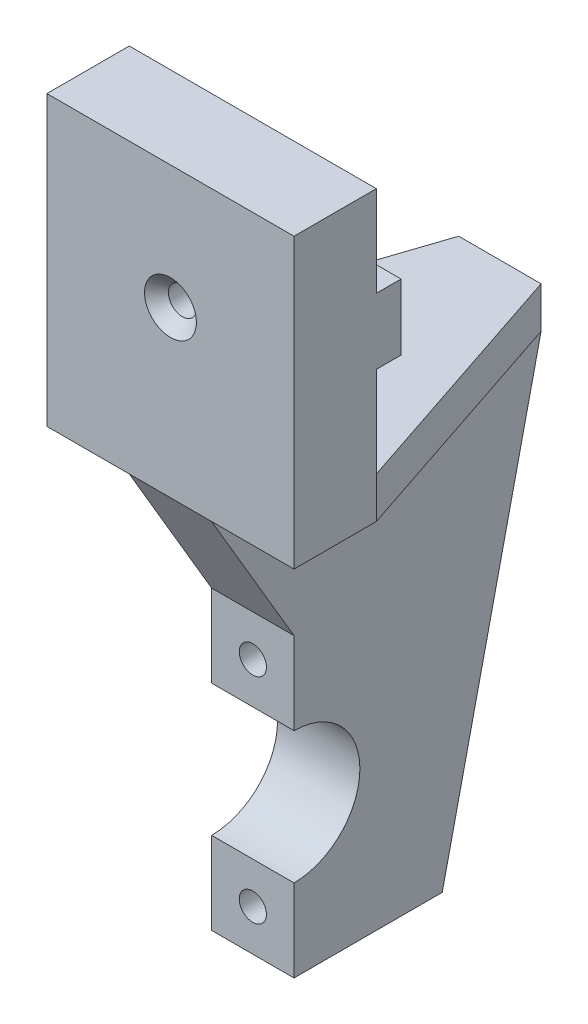
ISO-10303-21;
HEADER;
FILE_DESCRIPTION(('STEP AP214'),'2;1');
FILE_NAME('part.step','',(''),(''),'','','');
FILE_SCHEMA(('AUTOMOTIVE_DESIGN { 1 0 10303 214 1 1 1 1 }'));
ENDSEC;
DATA;
#1=APPLICATION_CONTEXT('core data for automotive mechanical design processes');
#2=APPLICATION_PROTOCOL_DEFINITION('international standard','automotive_design',2000,#1);
#3=PRODUCT_CONTEXT('',#1,'mechanical');
#4=PRODUCT('Part','Part','',(#3));
#5=PRODUCT_RELATED_PRODUCT_CATEGORY('part','',(#4));
#6=PRODUCT_DEFINITION_FORMATION('','',#4);
#7=PRODUCT_DEFINITION_CONTEXT('part definition',#1,'design');
#8=PRODUCT_DEFINITION('design','',#6,#7);
#9=PRODUCT_DEFINITION_SHAPE('','',#8);
#10=(LENGTH_UNIT() NAMED_UNIT(*) SI_UNIT(.MILLI.,.METRE.));
#11=(NAMED_UNIT(*) PLANE_ANGLE_UNIT() SI_UNIT($,.RADIAN.));
#12=(NAMED_UNIT(*) SI_UNIT($,.STERADIAN.) SOLID_ANGLE_UNIT());
#13=UNCERTAINTY_MEASURE_WITH_UNIT(LENGTH_MEASURE(1.E-05),#10,'distance_accuracy_value','');
#14=(GEOMETRIC_REPRESENTATION_CONTEXT(3) GLOBAL_UNCERTAINTY_ASSIGNED_CONTEXT((#13)) GLOBAL_UNIT_ASSIGNED_CONTEXT((#10,
#11,#12)) REPRESENTATION_CONTEXT('',''));
#15=CARTESIAN_POINT('',(0.,0.,0.));
#16=DIRECTION('',(0.,0.,1.));
#17=DIRECTION('',(1.,0.,0.));
#18=AXIS2_PLACEMENT_3D('',#15,#16,#17);
#19=CARTESIAN_POINT('',(0.,0.,0.));
#20=DIRECTION('',(0.,0.,1.));
#21=DIRECTION('',(1.,0.,0.));
#22=AXIS2_PLACEMENT_3D('',#19,#20,#21);
#23=PLANE('',#22);
#24=CARTESIAN_POINT('',(15.,15.,0.));
#25=DIRECTION('',(0.,0.,1.));
#26=DIRECTION('',(1.,0.,0.));
#27=AXIS2_PLACEMENT_3D('',#24,#25,#26);
#28=CIRCLE('',#27,1.7);
#29=CARTESIAN_POINT('',(16.7,15.,0.));
#30=VERTEX_POINT('',#29);
#31=EDGE_CURVE('E203',#30,#30,#28,.T.);
#32=ORIENTED_EDGE('',*,*,#31,.T.);
#33=EDGE_LOOP('',(#32));
#34=FACE_BOUND('',#33,.T.);
#35=DIRECTION('',(1.,0.,0.));
#36=VECTOR('',#35,1.);
#37=CARTESIAN_POINT('',(0.,19.,0.));
#38=LINE('',#37,#36);
#39=CARTESIAN_POINT('',(0.,19.,0.));
#40=VERTEX_POINT('',#39);
#41=CARTESIAN_POINT('',(5.,19.,0.));
#42=VERTEX_POINT('',#41);
#43=EDGE_CURVE('E212',#40,#42,#38,.T.);
#44=ORIENTED_EDGE('',*,*,#43,.F.);
#45=DIRECTION('',(0.,-1.,0.));
#46=VECTOR('',#45,1.);
#47=CARTESIAN_POINT('',(0.,30.,0.));
#48=LINE('',#47,#46);
#49=CARTESIAN_POINT('',(0.,30.,0.));
#50=VERTEX_POINT('',#49);
#51=EDGE_CURVE('E358',#50,#40,#48,.T.);
#52=ORIENTED_EDGE('',*,*,#51,.F.);
#53=DIRECTION('',(-1.,0.,0.));
#54=VECTOR('',#53,1.);
#55=CARTESIAN_POINT('',(0.,30.,0.));
#56=LINE('',#55,#54);
#57=CARTESIAN_POINT('',(30.,30.,0.));
#58=VERTEX_POINT('',#57);
#59=EDGE_CURVE('E354',#58,#50,#56,.T.);
#60=ORIENTED_EDGE('',*,*,#59,.F.);
#61=DIRECTION('',(0.,1.,0.));
#62=VECTOR('',#61,1.);
#63=CARTESIAN_POINT('',(30.,30.,0.));
#64=LINE('',#63,#62);
#65=CARTESIAN_POINT('',(30.,19.,0.));
#66=VERTEX_POINT('',#65);
#67=EDGE_CURVE('E364',#66,#58,#64,.T.);
#68=ORIENTED_EDGE('',*,*,#67,.F.);
#69=DIRECTION('',(1.,0.,0.));
#70=VECTOR('',#69,1.);
#71=CARTESIAN_POINT('',(30.,19.,0.));
#72=LINE('',#71,#70);
#73=CARTESIAN_POINT('',(25.,19.,0.));
#74=VERTEX_POINT('',#73);
#75=EDGE_CURVE('E241',#74,#66,#72,.T.);
#76=ORIENTED_EDGE('',*,*,#75,.F.);
#77=DIRECTION('',(0.,1.,0.));
#78=VECTOR('',#77,1.);
#79=CARTESIAN_POINT('',(25.,19.,0.));
#80=LINE('',#79,#78);
#81=CARTESIAN_POINT('',(25.,11.,0.));
#82=VERTEX_POINT('',#81);
#83=EDGE_CURVE('E58',#82,#74,#80,.T.);
#84=ORIENTED_EDGE('',*,*,#83,.F.);
#85=DIRECTION('',(-1.,0.,0.));
#86=VECTOR('',#85,1.);
#87=CARTESIAN_POINT('',(30.,11.,0.));
#88=LINE('',#87,#86);
#89=CARTESIAN_POINT('',(30.,11.,0.));
#90=VERTEX_POINT('',#89);
#91=EDGE_CURVE('E236',#90,#82,#88,.T.);
#92=ORIENTED_EDGE('',*,*,#91,.F.);
#93=CARTESIAN_POINT('',(30.,0.,0.));
#94=VERTEX_POINT('',#93);
#95=EDGE_CURVE('E365',#94,#90,#64,.T.);
#96=ORIENTED_EDGE('',*,*,#95,.F.);
#97=DIRECTION('',(1.,0.,0.));
#98=VECTOR('',#97,1.);
#99=CARTESIAN_POINT('',(0.,0.,0.));
#100=LINE('',#99,#98);
#101=CARTESIAN_POINT('',(0.,0.,0.));
#102=VERTEX_POINT('',#101);
#103=EDGE_CURVE('E361',#102,#94,#100,.T.);
#104=ORIENTED_EDGE('',*,*,#103,.F.);
#105=CARTESIAN_POINT('',(0.,11.,0.));
#106=VERTEX_POINT('',#105);
#107=EDGE_CURVE('E349',#106,#102,#48,.T.);
#108=ORIENTED_EDGE('',*,*,#107,.F.);
#109=DIRECTION('',(-1.,0.,0.));
#110=VECTOR('',#109,1.);
#111=CARTESIAN_POINT('',(0.,11.,0.));
#112=LINE('',#111,#110);
#113=CARTESIAN_POINT('',(5.,11.,0.));
#114=VERTEX_POINT('',#113);
#115=EDGE_CURVE('E217',#114,#106,#112,.T.);
#116=ORIENTED_EDGE('',*,*,#115,.F.);
#117=DIRECTION('',(0.,-1.,0.));
#118=VECTOR('',#117,1.);
#119=CARTESIAN_POINT('',(5.,19.,0.));
#120=LINE('',#119,#118);
#121=EDGE_CURVE('E224',#42,#114,#120,.T.);
#122=ORIENTED_EDGE('',*,*,#121,.F.);
#123=EDGE_LOOP('',(#44,#52,#60,#68,#76,#84,#92,#96,#104,#108,#116,#122));
#124=FACE_BOUND('',#123,.T.);
#125=ADVANCED_FACE('F35',(#34,#124),#23,.F.);
#126=CARTESIAN_POINT('',(0.,-5.,0.));
#127=DIRECTION('',(0.,-1.,0.));
#128=DIRECTION('',(0.,0.,-1.));
#129=AXIS2_PLACEMENT_3D('',#126,#127,#128);
#130=PLANE('',#129);
#131=DIRECTION('',(0.316227766016838,0.,-0.948683298050514));
#132=VECTOR('',#131,1.);
#133=CARTESIAN_POINT('',(0.,-5.,0.));
#134=LINE('',#133,#132);
#135=CARTESIAN_POINT('',(0.,-5.,0.));
#136=VERTEX_POINT('',#135);
#137=CARTESIAN_POINT('',(10.,-5.,-30.));
#138=VERTEX_POINT('',#137);
#139=EDGE_CURVE('E318',#136,#138,#134,.T.);
#140=ORIENTED_EDGE('',*,*,#139,.T.);
#141=DIRECTION('',(0.,0.,1.));
#142=VECTOR('',#141,1.);
#143=CARTESIAN_POINT('',(10.,-5.,10.));
#144=LINE('',#143,#142);
#145=CARTESIAN_POINT('',(10.,-5.,10.));
#146=VERTEX_POINT('',#145);
#147=EDGE_CURVE('E292',#138,#146,#144,.T.);
#148=ORIENTED_EDGE('',*,*,#147,.T.);
#149=DIRECTION('',(-1.,0.,0.));
#150=VECTOR('',#149,1.);
#151=CARTESIAN_POINT('',(0.,-5.,10.));
#152=LINE('',#151,#150);
#153=CARTESIAN_POINT('',(0.,-5.,10.));
#154=VERTEX_POINT('',#153);
#155=EDGE_CURVE('E329',#146,#154,#152,.T.);
#156=ORIENTED_EDGE('',*,*,#155,.T.);
#157=DIRECTION('',(0.,0.,-1.));
#158=VECTOR('',#157,1.);
#159=CARTESIAN_POINT('',(0.,-5.,10.));
#160=LINE('',#159,#158);
#161=EDGE_CURVE('E315',#154,#136,#160,.T.);
#162=ORIENTED_EDGE('',*,*,#161,.T.);
#163=EDGE_LOOP('',(#140,#148,#156,#162));
#164=FACE_BOUND('',#163,.T.);
#165=ADVANCED_FACE('F401',(#164),#130,.T.);
#166=CARTESIAN_POINT('',(0.,30.,10.));
#167=DIRECTION('',(1.,0.,0.));
#168=DIRECTION('',(0.,0.,-1.));
#169=AXIS2_PLACEMENT_3D('',#166,#167,#168);
#170=PLANE('',#169);
#171=ORIENTED_EDGE('',*,*,#51,.T.);
#172=DIRECTION('',(0.,0.,1.));
#173=VECTOR('',#172,1.);
#174=CARTESIAN_POINT('',(0.,19.,-3.));
#175=LINE('',#174,#173);
#176=CARTESIAN_POINT('',(0.,19.,-3.));
#177=VERTEX_POINT('',#176);
#178=EDGE_CURVE('E234',#177,#40,#175,.T.);
#179=ORIENTED_EDGE('',*,*,#178,.F.);
#180=DIRECTION('',(0.,1.,0.));
#181=VECTOR('',#180,1.);
#182=CARTESIAN_POINT('',(0.,19.,-3.));
#183=LINE('',#182,#181);
#184=CARTESIAN_POINT('',(0.,11.,-3.));
#185=VERTEX_POINT('',#184);
#186=EDGE_CURVE('E213',#185,#177,#183,.T.);
#187=ORIENTED_EDGE('',*,*,#186,.F.);
#188=DIRECTION('',(0.,0.,1.));
#189=VECTOR('',#188,1.);
#190=CARTESIAN_POINT('',(0.,11.,-3.));
#191=LINE('',#190,#189);
#192=EDGE_CURVE('E50',#185,#106,#191,.T.);
#193=ORIENTED_EDGE('',*,*,#192,.T.);
#194=ORIENTED_EDGE('',*,*,#107,.T.);
#195=DIRECTION('',(0.,1.,0.));
#196=VECTOR('',#195,1.);
#197=CARTESIAN_POINT('',(0.,-5.,0.));
#198=LINE('',#197,#196);
#199=EDGE_CURVE('E346',#136,#102,#198,.T.);
#200=ORIENTED_EDGE('',*,*,#199,.F.);
#201=ORIENTED_EDGE('',*,*,#161,.F.);
#202=DIRECTION('',(0.,-1.,0.));
#203=VECTOR('',#202,1.);
#204=CARTESIAN_POINT('',(0.,30.,10.));
#205=LINE('',#204,#203);
#206=CARTESIAN_POINT('',(0.,30.,10.));
#207=VERTEX_POINT('',#206);
#208=EDGE_CURVE('E350',#207,#154,#205,.T.);
#209=ORIENTED_EDGE('',*,*,#208,.F.);
#210=DIRECTION('',(0.,0.,-1.));
#211=VECTOR('',#210,1.);
#212=CARTESIAN_POINT('',(0.,30.,10.));
#213=LINE('',#212,#211);
#214=EDGE_CURVE('E43',#207,#50,#213,.T.);
#215=ORIENTED_EDGE('',*,*,#214,.T.);
#216=EDGE_LOOP('',(#171,#179,#187,#193,#194,#200,#201,#209,#215));
#217=FACE_BOUND('',#216,.T.);
#218=ADVANCED_FACE('F37',(#217),#170,.F.);
#219=CARTESIAN_POINT('',(30.,30.,10.));
#220=DIRECTION('',(-1.,0.,0.));
#221=DIRECTION('',(0.,-1.,0.));
#222=AXIS2_PLACEMENT_3D('',#219,#220,#221);
#223=PLANE('',#222);
#224=ORIENTED_EDGE('',*,*,#95,.T.);
#225=DIRECTION('',(0.,0.,1.));
#226=VECTOR('',#225,1.);
#227=CARTESIAN_POINT('',(30.,11.,-3.));
#228=LINE('',#227,#226);
#229=CARTESIAN_POINT('',(30.,11.,-3.));
#230=VERTEX_POINT('',#229);
#231=EDGE_CURVE('E260',#230,#90,#228,.T.);
#232=ORIENTED_EDGE('',*,*,#231,.F.);
#233=DIRECTION('',(0.,-1.,0.));
#234=VECTOR('',#233,1.);
#235=CARTESIAN_POINT('',(30.,19.,-3.));
#236=LINE('',#235,#234);
#237=CARTESIAN_POINT('',(30.,19.,-3.));
#238=VERTEX_POINT('',#237);
#239=EDGE_CURVE('E237',#238,#230,#236,.T.);
#240=ORIENTED_EDGE('',*,*,#239,.F.);
#241=DIRECTION('',(0.,0.,1.));
#242=VECTOR('',#241,1.);
#243=CARTESIAN_POINT('',(30.,19.,-3.));
#244=LINE('',#243,#242);
#245=EDGE_CURVE('E247',#238,#66,#244,.T.);
#246=ORIENTED_EDGE('',*,*,#245,.T.);
#247=ORIENTED_EDGE('',*,*,#67,.T.);
#248=DIRECTION('',(0.,0.,-1.));
#249=VECTOR('',#248,1.);
#250=CARTESIAN_POINT('',(30.,30.,10.));
#251=LINE('',#250,#249);
#252=CARTESIAN_POINT('',(30.,30.,10.));
#253=VERTEX_POINT('',#252);
#254=EDGE_CURVE('E11',#253,#58,#251,.T.);
#255=ORIENTED_EDGE('',*,*,#254,.F.);
#256=DIRECTION('',(0.,1.,0.));
#257=VECTOR('',#256,1.);
#258=CARTESIAN_POINT('',(30.,30.,10.));
#259=LINE('',#258,#257);
#260=CARTESIAN_POINT('',(30.,-5.,10.));
#261=VERTEX_POINT('',#260);
#262=EDGE_CURVE('E353',#261,#253,#259,.T.);
#263=ORIENTED_EDGE('',*,*,#262,.F.);
#264=DIRECTION('',(0.,0.,1.));
#265=VECTOR('',#264,1.);
#266=CARTESIAN_POINT('',(30.,-5.,10.));
#267=LINE('',#266,#265);
#268=CARTESIAN_POINT('',(30.,-5.,0.));
#269=VERTEX_POINT('',#268);
#270=EDGE_CURVE('E326',#269,#261,#267,.T.);
#271=ORIENTED_EDGE('',*,*,#270,.F.);
#272=DIRECTION('',(0.,1.,0.));
#273=VECTOR('',#272,1.);
#274=CARTESIAN_POINT('',(30.,-5.,0.));
#275=LINE('',#274,#273);
#276=EDGE_CURVE('E332',#269,#94,#275,.T.);
#277=ORIENTED_EDGE('',*,*,#276,.T.);
#278=EDGE_LOOP('',(#224,#232,#240,#246,#247,#255,#263,#271,#277));
#279=FACE_BOUND('',#278,.T.);
#280=ADVANCED_FACE('F411',(#279),#223,.F.);
#281=CARTESIAN_POINT('',(0.,30.,10.));
#282=DIRECTION('',(0.,-1.,0.));
#283=DIRECTION('',(0.,0.,-1.));
#284=AXIS2_PLACEMENT_3D('',#281,#282,#283);
#285=PLANE('',#284);
#286=ORIENTED_EDGE('',*,*,#59,.T.);
#287=ORIENTED_EDGE('',*,*,#214,.F.);
#288=DIRECTION('',(-1.,0.,0.));
#289=VECTOR('',#288,1.);
#290=CARTESIAN_POINT('',(0.,30.,10.));
#291=LINE('',#290,#289);
#292=EDGE_CURVE('E356',#253,#207,#291,.T.);
#293=ORIENTED_EDGE('',*,*,#292,.F.);
#294=ORIENTED_EDGE('',*,*,#254,.T.);
#295=EDGE_LOOP('',(#286,#287,#293,#294));
#296=FACE_BOUND('',#295,.T.);
#297=ADVANCED_FACE('F409',(#296),#285,.F.);
#298=CARTESIAN_POINT('',(0.,0.,10.));
#299=DIRECTION('',(0.,0.,1.));
#300=DIRECTION('',(1.,0.,0.));
#301=AXIS2_PLACEMENT_3D('',#298,#299,#300);
#302=PLANE('',#301);
#303=CARTESIAN_POINT('',(15.,15.,10.));
#304=DIRECTION('',(0.,0.,1.));
#305=DIRECTION('',(1.,0.,0.));
#306=AXIS2_PLACEMENT_3D('',#303,#304,#305);
#307=CIRCLE('',#306,3.15);
#308=CARTESIAN_POINT('',(18.15,15.,10.));
#309=VERTEX_POINT('',#308);
#310=EDGE_CURVE('E209',#309,#309,#307,.T.);
#311=ORIENTED_EDGE('',*,*,#310,.F.);
#312=EDGE_LOOP('',(#311));
#313=FACE_BOUND('',#312,.T.);
#314=ORIENTED_EDGE('',*,*,#208,.T.);
#315=ORIENTED_EDGE('',*,*,#155,.F.);
#316=DIRECTION('',(-1.,0.,0.));
#317=VECTOR('',#316,1.);
#318=CARTESIAN_POINT('',(20.,-5.,10.));
#319=LINE('',#318,#317);
#320=CARTESIAN_POINT('',(20.,-5.,10.));
#321=VERTEX_POINT('',#320);
#322=EDGE_CURVE('E302',#321,#146,#319,.T.);
#323=ORIENTED_EDGE('',*,*,#322,.F.);
#324=EDGE_CURVE('E330',#261,#321,#152,.T.);
#325=ORIENTED_EDGE('',*,*,#324,.F.);
#326=ORIENTED_EDGE('',*,*,#262,.T.);
#327=ORIENTED_EDGE('',*,*,#292,.T.);
#328=EDGE_LOOP('',(#314,#315,#323,#325,#326,#327));
#329=FACE_BOUND('',#328,.T.);
#330=ADVANCED_FACE('F406',(#313,#329),#302,.T.);
#331=CARTESIAN_POINT('',(0.,0.,0.));
#332=DIRECTION('',(0.,-1.,0.));
#333=DIRECTION('',(0.,0.,-1.));
#334=AXIS2_PLACEMENT_3D('',#331,#332,#333);
#335=PLANE('',#334);
#336=DIRECTION('',(0.316227766016838,0.,-0.948683298050514));
#337=VECTOR('',#336,1.);
#338=CARTESIAN_POINT('',(0.,0.,0.));
#339=LINE('',#338,#337);
#340=CARTESIAN_POINT('',(10.,0.,-30.));
#341=VERTEX_POINT('',#340);
#342=EDGE_CURVE('E314',#102,#341,#339,.T.);
#343=ORIENTED_EDGE('',*,*,#342,.F.);
#344=ORIENTED_EDGE('',*,*,#103,.T.);
#345=DIRECTION('',(0.316227766016838,0.,0.948683298050514));
#346=VECTOR('',#345,1.);
#347=CARTESIAN_POINT('',(20.,0.,-30.));
#348=LINE('',#347,#346);
#349=CARTESIAN_POINT('',(20.,0.,-30.));
#350=VERTEX_POINT('',#349);
#351=EDGE_CURVE('E319',#350,#94,#348,.T.);
#352=ORIENTED_EDGE('',*,*,#351,.F.);
#353=DIRECTION('',(1.,0.,0.));
#354=VECTOR('',#353,1.);
#355=CARTESIAN_POINT('',(10.,0.,-30.));
#356=LINE('',#355,#354);
#357=EDGE_CURVE('E334',#341,#350,#356,.T.);
#358=ORIENTED_EDGE('',*,*,#357,.F.);
#359=EDGE_LOOP('',(#343,#344,#352,#358));
#360=FACE_BOUND('',#359,.T.);
#361=ADVANCED_FACE('F434',(#360),#335,.F.);
#362=CARTESIAN_POINT('',(0.,-5.,0.));
#363=DIRECTION('',(0.948683298050514,0.,0.316227766016838));
#364=DIRECTION('',(0.316227766016838,0.,-0.948683298050514));
#365=AXIS2_PLACEMENT_3D('',#362,#363,#364);
#366=PLANE('',#365);
#367=ORIENTED_EDGE('',*,*,#342,.T.);
#368=DIRECTION('',(0.,1.,0.));
#369=VECTOR('',#368,1.);
#370=CARTESIAN_POINT('',(10.,-5.,-30.));
#371=LINE('',#370,#369);
#372=EDGE_CURVE('E343',#138,#341,#371,.T.);
#373=ORIENTED_EDGE('',*,*,#372,.F.);
#374=ORIENTED_EDGE('',*,*,#139,.F.);
#375=ORIENTED_EDGE('',*,*,#199,.T.);
#376=EDGE_LOOP('',(#367,#373,#374,#375));
#377=FACE_BOUND('',#376,.T.);
#378=ADVANCED_FACE('F397',(#377),#366,.F.);
#379=CARTESIAN_POINT('',(10.,-5.,-30.));
#380=DIRECTION('',(0.,0.,1.));
#381=DIRECTION('',(1.,0.,0.));
#382=AXIS2_PLACEMENT_3D('',#379,#380,#381);
#383=PLANE('',#382);
#384=ORIENTED_EDGE('',*,*,#357,.T.);
#385=DIRECTION('',(0.,1.,0.));
#386=VECTOR('',#385,1.);
#387=CARTESIAN_POINT('',(20.,-5.,-30.));
#388=LINE('',#387,#386);
#389=CARTESIAN_POINT('',(20.,-5.,-30.));
#390=VERTEX_POINT('',#389);
#391=EDGE_CURVE('E340',#390,#350,#388,.T.);
#392=ORIENTED_EDGE('',*,*,#391,.F.);
#393=DIRECTION('',(1.,0.,0.));
#394=VECTOR('',#393,1.);
#395=CARTESIAN_POINT('',(10.,-5.,-30.));
#396=LINE('',#395,#394);
#397=EDGE_CURVE('E321',#138,#390,#396,.T.);
#398=ORIENTED_EDGE('',*,*,#397,.F.);
#399=ORIENTED_EDGE('',*,*,#372,.T.);
#400=EDGE_LOOP('',(#384,#392,#398,#399));
#401=FACE_BOUND('',#400,.T.);
#402=ADVANCED_FACE('F436',(#401),#383,.F.);
#403=CARTESIAN_POINT('',(20.,-5.,-30.));
#404=DIRECTION('',(-0.948683298050514,0.,0.316227766016838));
#405=DIRECTION('',(0.316227766016838,0.,0.948683298050514));
#406=AXIS2_PLACEMENT_3D('',#403,#404,#405);
#407=PLANE('',#406);
#408=ORIENTED_EDGE('',*,*,#351,.T.);
#409=ORIENTED_EDGE('',*,*,#276,.F.);
#410=DIRECTION('',(0.316227766016838,0.,0.948683298050514));
#411=VECTOR('',#410,1.);
#412=CARTESIAN_POINT('',(20.,-5.,-30.));
#413=LINE('',#412,#411);
#414=EDGE_CURVE('E324',#390,#269,#413,.T.);
#415=ORIENTED_EDGE('',*,*,#414,.F.);
#416=ORIENTED_EDGE('',*,*,#391,.T.);
#417=EDGE_LOOP('',(#408,#409,#415,#416));
#418=FACE_BOUND('',#417,.T.);
#419=ADVANCED_FACE('F429',(#418),#407,.F.);
#420=DIRECTION('',(0.,0.,1.));
#421=VECTOR('',#420,1.);
#422=CARTESIAN_POINT('',(20.,-5.,10.));
#423=LINE('',#422,#421);
#424=EDGE_CURVE('E275',#390,#321,#423,.T.);
#425=ORIENTED_EDGE('',*,*,#424,.F.);
#426=ORIENTED_EDGE('',*,*,#414,.T.);
#427=ORIENTED_EDGE('',*,*,#270,.T.);
#428=ORIENTED_EDGE('',*,*,#324,.T.);
#429=EDGE_LOOP('',(#425,#426,#427,#428));
#430=FACE_BOUND('',#429,.T.);
#431=ADVANCED_FACE('F461',(#430),#130,.T.);
#432=CARTESIAN_POINT('',(20.,-40.,0.));
#433=DIRECTION('',(-1.,0.,0.));
#434=DIRECTION('',(0.,-1.,0.));
#435=AXIS2_PLACEMENT_3D('',#432,#433,#434);
#436=CYLINDRICAL_SURFACE('',#435,8.);
#437=CARTESIAN_POINT('',(10.,-40.,0.));
#438=DIRECTION('',(-1.,0.,0.));
#439=DIRECTION('',(0.,1.,0.));
#440=AXIS2_PLACEMENT_3D('',#437,#438,#439);
#441=CIRCLE('',#440,8.);
#442=CARTESIAN_POINT('',(10.,-32.,0.));
#443=VERTEX_POINT('',#442);
#444=CARTESIAN_POINT('',(10.,-48.,0.));
#445=VERTEX_POINT('',#444);
#446=EDGE_CURVE('E263',#443,#445,#441,.T.);
#447=ORIENTED_EDGE('',*,*,#446,.T.);
#448=DIRECTION('',(-1.,0.,0.));
#449=VECTOR('',#448,1.);
#450=CARTESIAN_POINT('',(20.,-48.,0.));
#451=LINE('',#450,#449);
#452=CARTESIAN_POINT('',(20.,-48.,0.));
#453=VERTEX_POINT('',#452);
#454=EDGE_CURVE('E311',#453,#445,#451,.T.);
#455=ORIENTED_EDGE('',*,*,#454,.F.);
#456=CARTESIAN_POINT('',(20.,-40.,0.));
#457=DIRECTION('',(-1.,0.,0.));
#458=DIRECTION('',(0.,1.,0.));
#459=AXIS2_PLACEMENT_3D('',#456,#457,#458);
#460=CIRCLE('',#459,8.);
#461=CARTESIAN_POINT('',(20.,-32.,0.));
#462=VERTEX_POINT('',#461);
#463=EDGE_CURVE('E264',#462,#453,#460,.T.);
#464=ORIENTED_EDGE('',*,*,#463,.F.);
#465=DIRECTION('',(-1.,0.,0.));
#466=VECTOR('',#465,1.);
#467=CARTESIAN_POINT('',(20.,-32.,0.));
#468=LINE('',#467,#466);
#469=EDGE_CURVE('E282',#462,#443,#468,.T.);
#470=ORIENTED_EDGE('',*,*,#469,.T.);
#471=EDGE_LOOP('',(#447,#455,#464,#470));
#472=FACE_BOUND('',#471,.T.);
#473=ADVANCED_FACE('F463',(#472),#436,.F.);
#474=CARTESIAN_POINT('',(20.,-48.,0.));
#475=DIRECTION('',(0.,0.,-1.));
#476=DIRECTION('',(0.,1.,0.));
#477=AXIS2_PLACEMENT_3D('',#474,#475,#476);
#478=PLANE('',#477);
#479=CARTESIAN_POINT('',(15.,-53.,0.));
#480=DIRECTION('',(0.,0.,1.));
#481=DIRECTION('',(1.,0.,0.));
#482=AXIS2_PLACEMENT_3D('',#479,#480,#481);
#483=CIRCLE('',#482,1.65);
#484=CARTESIAN_POINT('',(16.65,-53.,0.));
#485=VERTEX_POINT('',#484);
#486=EDGE_CURVE('E200',#485,#485,#483,.T.);
#487=ORIENTED_EDGE('',*,*,#486,.F.);
#488=EDGE_LOOP('',(#487));
#489=FACE_BOUND('',#488,.T.);
#490=DIRECTION('',(0.,-1.,0.));
#491=VECTOR('',#490,1.);
#492=CARTESIAN_POINT('',(10.,-48.,0.));
#493=LINE('',#492,#491);
#494=CARTESIAN_POINT('',(10.,-58.,0.));
#495=VERTEX_POINT('',#494);
#496=EDGE_CURVE('E285',#445,#495,#493,.T.);
#497=ORIENTED_EDGE('',*,*,#496,.T.);
#498=DIRECTION('',(-1.,0.,0.));
#499=VECTOR('',#498,1.);
#500=CARTESIAN_POINT('',(20.,-58.,0.));
#501=LINE('',#500,#499);
#502=CARTESIAN_POINT('',(20.,-58.,0.));
#503=VERTEX_POINT('',#502);
#504=EDGE_CURVE('E308',#503,#495,#501,.T.);
#505=ORIENTED_EDGE('',*,*,#504,.F.);
#506=DIRECTION('',(0.,-1.,0.));
#507=VECTOR('',#506,1.);
#508=CARTESIAN_POINT('',(20.,-48.,0.));
#509=LINE('',#508,#507);
#510=EDGE_CURVE('E267',#453,#503,#509,.T.);
#511=ORIENTED_EDGE('',*,*,#510,.F.);
#512=ORIENTED_EDGE('',*,*,#454,.T.);
#513=EDGE_LOOP('',(#497,#505,#511,#512));
#514=FACE_BOUND('',#513,.T.);
#515=ADVANCED_FACE('F469',(#489,#514),#478,.F.);
#516=CARTESIAN_POINT('',(20.,-58.,0.));
#517=DIRECTION('',(0.,1.,0.));
#518=DIRECTION('',(-1.,0.,0.));
#519=AXIS2_PLACEMENT_3D('',#516,#517,#518);
#520=PLANE('',#519);
#521=DIRECTION('',(0.,0.,-1.));
#522=VECTOR('',#521,1.);
#523=CARTESIAN_POINT('',(10.,-58.,0.));
#524=LINE('',#523,#522);
#525=CARTESIAN_POINT('',(10.,-58.,-18.));
#526=VERTEX_POINT('',#525);
#527=EDGE_CURVE('E287',#495,#526,#524,.T.);
#528=ORIENTED_EDGE('',*,*,#527,.T.);
#529=DIRECTION('',(-1.,0.,0.));
#530=VECTOR('',#529,1.);
#531=CARTESIAN_POINT('',(20.,-58.,-18.));
#532=LINE('',#531,#530);
#533=CARTESIAN_POINT('',(20.,-58.,-18.));
#534=VERTEX_POINT('',#533);
#535=EDGE_CURVE('E305',#534,#526,#532,.T.);
#536=ORIENTED_EDGE('',*,*,#535,.F.);
#537=DIRECTION('',(0.,0.,-1.));
#538=VECTOR('',#537,1.);
#539=CARTESIAN_POINT('',(20.,-58.,0.));
#540=LINE('',#539,#538);
#541=EDGE_CURVE('E270',#503,#534,#540,.T.);
#542=ORIENTED_EDGE('',*,*,#541,.F.);
#543=ORIENTED_EDGE('',*,*,#504,.T.);
#544=EDGE_LOOP('',(#528,#536,#542,#543));
#545=FACE_BOUND('',#544,.T.);
#546=ADVANCED_FACE('F538',(#545),#520,.F.);
#547=CARTESIAN_POINT('',(20.,-58.,-18.));
#548=DIRECTION('',(0.,0.220825652597795,0.975313298973595));
#549=DIRECTION('',(0.,-0.975313298973595,0.220825652597795));
#550=AXIS2_PLACEMENT_3D('',#547,#548,#549);
#551=PLANE('',#550);
#552=DIRECTION('',(0.,0.975313298973595,-0.220825652597795));
#553=VECTOR('',#552,1.);
#554=CARTESIAN_POINT('',(10.,-58.,-18.));
#555=LINE('',#554,#553);
#556=EDGE_CURVE('E289',#526,#138,#555,.T.);
#557=ORIENTED_EDGE('',*,*,#556,.T.);
#558=ORIENTED_EDGE('',*,*,#397,.T.);
#559=DIRECTION('',(0.,0.975313298973595,-0.220825652597795));
#560=VECTOR('',#559,1.);
#561=CARTESIAN_POINT('',(20.,-58.,-18.));
#562=LINE('',#561,#560);
#563=EDGE_CURVE('E272',#534,#390,#562,.T.);
#564=ORIENTED_EDGE('',*,*,#563,.F.);
#565=ORIENTED_EDGE('',*,*,#535,.T.);
#566=EDGE_LOOP('',(#557,#558,#564,#565));
#567=FACE_BOUND('',#566,.T.);
#568=ADVANCED_FACE('F440',(#567),#551,.F.);
#569=CARTESIAN_POINT('',(20.,-5.,10.));
#570=DIRECTION('',(0.,0.507020126563394,-0.861934215157769));
#571=DIRECTION('',(0.,0.86193421515777,0.507020126563394));
#572=AXIS2_PLACEMENT_3D('',#569,#570,#571);
#573=PLANE('',#572);
#574=DIRECTION('',(0.,-0.86193421515777,-0.507020126563394));
#575=VECTOR('',#574,1.);
#576=CARTESIAN_POINT('',(10.,-5.,10.));
#577=LINE('',#576,#575);
#578=CARTESIAN_POINT('',(10.,-22.,0.));
#579=VERTEX_POINT('',#578);
#580=EDGE_CURVE('E294',#146,#579,#577,.T.);
#581=ORIENTED_EDGE('',*,*,#580,.T.);
#582=DIRECTION('',(-1.,0.,0.));
#583=VECTOR('',#582,1.);
#584=CARTESIAN_POINT('',(20.,-22.,0.));
#585=LINE('',#584,#583);
#586=CARTESIAN_POINT('',(20.,-22.,0.));
#587=VERTEX_POINT('',#586);
#588=EDGE_CURVE('E299',#587,#579,#585,.T.);
#589=ORIENTED_EDGE('',*,*,#588,.F.);
#590=DIRECTION('',(0.,-0.86193421515777,-0.507020126563394));
#591=VECTOR('',#590,1.);
#592=CARTESIAN_POINT('',(20.,-5.,10.));
#593=LINE('',#592,#591);
#594=EDGE_CURVE('E278',#321,#587,#593,.T.);
#595=ORIENTED_EDGE('',*,*,#594,.F.);
#596=ORIENTED_EDGE('',*,*,#322,.T.);
#597=EDGE_LOOP('',(#581,#589,#595,#596));
#598=FACE_BOUND('',#597,.T.);
#599=ADVANCED_FACE('F450',(#598),#573,.F.);
#600=CARTESIAN_POINT('',(20.,-32.,0.));
#601=DIRECTION('',(0.,0.,-1.));
#602=DIRECTION('',(-1.,0.,0.));
#603=AXIS2_PLACEMENT_3D('',#600,#601,#602);
#604=PLANE('',#603);
#605=CARTESIAN_POINT('',(15.,-27.,0.));
#606=DIRECTION('',(0.,0.,1.));
#607=DIRECTION('',(1.,0.,0.));
#608=AXIS2_PLACEMENT_3D('',#605,#606,#607);
#609=CIRCLE('',#608,1.65);
#610=CARTESIAN_POINT('',(16.65,-27.,0.));
#611=VERTEX_POINT('',#610);
#612=EDGE_CURVE('E192',#611,#611,#609,.T.);
#613=ORIENTED_EDGE('',*,*,#612,.F.);
#614=EDGE_LOOP('',(#613));
#615=FACE_BOUND('',#614,.T.);
#616=DIRECTION('',(0.,-1.,0.));
#617=VECTOR('',#616,1.);
#618=CARTESIAN_POINT('',(10.,-32.,0.));
#619=LINE('',#618,#617);
#620=EDGE_CURVE('E268',#579,#443,#619,.T.);
#621=ORIENTED_EDGE('',*,*,#620,.T.);
#622=ORIENTED_EDGE('',*,*,#469,.F.);
#623=DIRECTION('',(0.,-1.,0.));
#624=VECTOR('',#623,1.);
#625=CARTESIAN_POINT('',(20.,-32.,0.));
#626=LINE('',#625,#624);
#627=EDGE_CURVE('E280',#587,#462,#626,.T.);
#628=ORIENTED_EDGE('',*,*,#627,.F.);
#629=ORIENTED_EDGE('',*,*,#588,.T.);
#630=EDGE_LOOP('',(#621,#622,#628,#629));
#631=FACE_BOUND('',#630,.T.);
#632=ADVANCED_FACE('F454',(#615,#631),#604,.F.);
#633=CARTESIAN_POINT('',(20.,-40.,0.));
#634=DIRECTION('',(1.,0.,0.));
#635=DIRECTION('',(0.,1.,0.));
#636=AXIS2_PLACEMENT_3D('',#633,#634,#635);
#637=PLANE('',#636);
#638=ORIENTED_EDGE('',*,*,#463,.T.);
#639=ORIENTED_EDGE('',*,*,#510,.T.);
#640=ORIENTED_EDGE('',*,*,#541,.T.);
#641=ORIENTED_EDGE('',*,*,#563,.T.);
#642=ORIENTED_EDGE('',*,*,#424,.T.);
#643=ORIENTED_EDGE('',*,*,#594,.T.);
#644=ORIENTED_EDGE('',*,*,#627,.T.);
#645=EDGE_LOOP('',(#638,#639,#640,#641,#642,#643,#644));
#646=FACE_BOUND('',#645,.T.);
#647=ADVANCED_FACE('F458',(#646),#637,.T.);
#648=CARTESIAN_POINT('',(10.,-40.,0.));
#649=DIRECTION('',(1.,0.,0.));
#650=DIRECTION('',(0.,1.,0.));
#651=AXIS2_PLACEMENT_3D('',#648,#649,#650);
#652=PLANE('',#651);
#653=ORIENTED_EDGE('',*,*,#446,.F.);
#654=ORIENTED_EDGE('',*,*,#620,.F.);
#655=ORIENTED_EDGE('',*,*,#580,.F.);
#656=ORIENTED_EDGE('',*,*,#147,.F.);
#657=ORIENTED_EDGE('',*,*,#556,.F.);
#658=ORIENTED_EDGE('',*,*,#527,.F.);
#659=ORIENTED_EDGE('',*,*,#496,.F.);
#660=EDGE_LOOP('',(#653,#654,#655,#656,#657,#658,#659));
#661=FACE_BOUND('',#660,.T.);
#662=ADVANCED_FACE('F446',(#661),#652,.F.);
#663=CARTESIAN_POINT('',(30.,11.,-3.));
#664=DIRECTION('',(0.,1.,0.));
#665=DIRECTION('',(0.,0.,1.));
#666=AXIS2_PLACEMENT_3D('',#663,#664,#665);
#667=PLANE('',#666);
#668=ORIENTED_EDGE('',*,*,#91,.T.);
#669=DIRECTION('',(0.,0.,1.));
#670=VECTOR('',#669,1.);
#671=CARTESIAN_POINT('',(25.,11.,-3.));
#672=LINE('',#671,#670);
#673=CARTESIAN_POINT('',(25.,11.,-3.));
#674=VERTEX_POINT('',#673);
#675=EDGE_CURVE('E257',#674,#82,#672,.T.);
#676=ORIENTED_EDGE('',*,*,#675,.F.);
#677=DIRECTION('',(-1.,0.,0.));
#678=VECTOR('',#677,1.);
#679=CARTESIAN_POINT('',(30.,11.,-3.));
#680=LINE('',#679,#678);
#681=EDGE_CURVE('E240',#230,#674,#680,.T.);
#682=ORIENTED_EDGE('',*,*,#681,.F.);
#683=ORIENTED_EDGE('',*,*,#231,.T.);
#684=EDGE_LOOP('',(#668,#676,#682,#683));
#685=FACE_BOUND('',#684,.T.);
#686=ADVANCED_FACE('F424',(#685),#667,.F.);
#687=CARTESIAN_POINT('',(25.,19.,-3.));
#688=DIRECTION('',(1.,0.,0.));
#689=DIRECTION('',(0.,1.,0.));
#690=AXIS2_PLACEMENT_3D('',#687,#688,#689);
#691=PLANE('',#690);
#692=ORIENTED_EDGE('',*,*,#83,.T.);
#693=DIRECTION('',(0.,0.,1.));
#694=VECTOR('',#693,1.);
#695=CARTESIAN_POINT('',(25.,19.,-3.));
#696=LINE('',#695,#694);
#697=CARTESIAN_POINT('',(25.,19.,-3.));
#698=VERTEX_POINT('',#697);
#699=EDGE_CURVE('E254',#698,#74,#696,.T.);
#700=ORIENTED_EDGE('',*,*,#699,.F.);
#701=DIRECTION('',(0.,1.,0.));
#702=VECTOR('',#701,1.);
#703=CARTESIAN_POINT('',(25.,19.,-3.));
#704=LINE('',#703,#702);
#705=EDGE_CURVE('E243',#674,#698,#704,.T.);
#706=ORIENTED_EDGE('',*,*,#705,.F.);
#707=ORIENTED_EDGE('',*,*,#675,.T.);
#708=EDGE_LOOP('',(#692,#700,#706,#707));
#709=FACE_BOUND('',#708,.T.);
#710=ADVANCED_FACE('F421',(#709),#691,.F.);
#711=CARTESIAN_POINT('',(30.,19.,-3.));
#712=DIRECTION('',(0.,-1.,0.));
#713=DIRECTION('',(0.,0.,-1.));
#714=AXIS2_PLACEMENT_3D('',#711,#712,#713);
#715=PLANE('',#714);
#716=ORIENTED_EDGE('',*,*,#75,.T.);
#717=ORIENTED_EDGE('',*,*,#245,.F.);
#718=DIRECTION('',(1.,0.,0.));
#719=VECTOR('',#718,1.);
#720=CARTESIAN_POINT('',(30.,19.,-3.));
#721=LINE('',#720,#719);
#722=EDGE_CURVE('E245',#698,#238,#721,.T.);
#723=ORIENTED_EDGE('',*,*,#722,.F.);
#724=ORIENTED_EDGE('',*,*,#699,.T.);
#725=EDGE_LOOP('',(#716,#717,#723,#724));
#726=FACE_BOUND('',#725,.T.);
#727=ADVANCED_FACE('F416',(#726),#715,.F.);
#728=CARTESIAN_POINT('',(0.,0.,-3.));
#729=DIRECTION('',(0.,0.,-1.));
#730=DIRECTION('',(-1.,0.,0.));
#731=AXIS2_PLACEMENT_3D('',#728,#729,#730);
#732=PLANE('',#731);
#733=ORIENTED_EDGE('',*,*,#239,.T.);
#734=ORIENTED_EDGE('',*,*,#681,.T.);
#735=ORIENTED_EDGE('',*,*,#705,.T.);
#736=ORIENTED_EDGE('',*,*,#722,.T.);
#737=EDGE_LOOP('',(#733,#734,#735,#736));
#738=FACE_BOUND('',#737,.T.);
#739=ADVANCED_FACE('F597',(#738),#732,.T.);
#740=CARTESIAN_POINT('',(0.,19.,-3.));
#741=DIRECTION('',(0.,-1.,0.));
#742=DIRECTION('',(0.,0.,-1.));
#743=AXIS2_PLACEMENT_3D('',#740,#741,#742);
#744=PLANE('',#743);
#745=ORIENTED_EDGE('',*,*,#43,.T.);
#746=DIRECTION('',(0.,0.,1.));
#747=VECTOR('',#746,1.);
#748=CARTESIAN_POINT('',(5.,19.,-3.));
#749=LINE('',#748,#747);
#750=CARTESIAN_POINT('',(5.,19.,-3.));
#751=VERTEX_POINT('',#750);
#752=EDGE_CURVE('E231',#751,#42,#749,.T.);
#753=ORIENTED_EDGE('',*,*,#752,.F.);
#754=DIRECTION('',(1.,0.,0.));
#755=VECTOR('',#754,1.);
#756=CARTESIAN_POINT('',(0.,19.,-3.));
#757=LINE('',#756,#755);
#758=EDGE_CURVE('E216',#177,#751,#757,.T.);
#759=ORIENTED_EDGE('',*,*,#758,.F.);
#760=ORIENTED_EDGE('',*,*,#178,.T.);
#761=EDGE_LOOP('',(#745,#753,#759,#760));
#762=FACE_BOUND('',#761,.T.);
#763=ADVANCED_FACE('F382',(#762),#744,.F.);
#764=CARTESIAN_POINT('',(5.,19.,-3.));
#765=DIRECTION('',(-1.,0.,0.));
#766=DIRECTION('',(0.,-1.,0.));
#767=AXIS2_PLACEMENT_3D('',#764,#765,#766);
#768=PLANE('',#767);
#769=ORIENTED_EDGE('',*,*,#121,.T.);
#770=DIRECTION('',(0.,0.,1.));
#771=VECTOR('',#770,1.);
#772=CARTESIAN_POINT('',(5.,11.,-3.));
#773=LINE('',#772,#771);
#774=CARTESIAN_POINT('',(5.,11.,-3.));
#775=VERTEX_POINT('',#774);
#776=EDGE_CURVE('E228',#775,#114,#773,.T.);
#777=ORIENTED_EDGE('',*,*,#776,.F.);
#778=DIRECTION('',(0.,-1.,0.));
#779=VECTOR('',#778,1.);
#780=CARTESIAN_POINT('',(5.,19.,-3.));
#781=LINE('',#780,#779);
#782=EDGE_CURVE('E219',#751,#775,#781,.T.);
#783=ORIENTED_EDGE('',*,*,#782,.F.);
#784=ORIENTED_EDGE('',*,*,#752,.T.);
#785=EDGE_LOOP('',(#769,#777,#783,#784));
#786=FACE_BOUND('',#785,.T.);
#787=ADVANCED_FACE('F385',(#786),#768,.F.);
#788=CARTESIAN_POINT('',(0.,11.,-3.));
#789=DIRECTION('',(0.,1.,0.));
#790=DIRECTION('',(-1.,0.,0.));
#791=AXIS2_PLACEMENT_3D('',#788,#789,#790);
#792=PLANE('',#791);
#793=ORIENTED_EDGE('',*,*,#115,.T.);
#794=ORIENTED_EDGE('',*,*,#192,.F.);
#795=DIRECTION('',(-1.,0.,0.));
#796=VECTOR('',#795,1.);
#797=CARTESIAN_POINT('',(0.,11.,-3.));
#798=LINE('',#797,#796);
#799=EDGE_CURVE('E221',#775,#185,#798,.T.);
#800=ORIENTED_EDGE('',*,*,#799,.F.);
#801=ORIENTED_EDGE('',*,*,#776,.T.);
#802=EDGE_LOOP('',(#793,#794,#800,#801));
#803=FACE_BOUND('',#802,.T.);
#804=ADVANCED_FACE('F391',(#803),#792,.F.);
#805=CARTESIAN_POINT('',(0.,0.,-3.));
#806=DIRECTION('',(0.,0.,1.));
#807=DIRECTION('',(1.,0.,0.));
#808=AXIS2_PLACEMENT_3D('',#805,#806,#807);
#809=PLANE('',#808);
#810=ORIENTED_EDGE('',*,*,#186,.T.);
#811=ORIENTED_EDGE('',*,*,#758,.T.);
#812=ORIENTED_EDGE('',*,*,#782,.T.);
#813=ORIENTED_EDGE('',*,*,#799,.T.);
#814=EDGE_LOOP('',(#810,#811,#812,#813));
#815=FACE_BOUND('',#814,.T.);
#816=ADVANCED_FACE('F389',(#815),#809,.F.);
#817=CARTESIAN_POINT('',(15.,15.,10.));
#818=DIRECTION('',(0.,0.,1.));
#819=DIRECTION('',(1.,0.,0.));
#820=AXIS2_PLACEMENT_3D('',#817,#818,#819);
#821=CONICAL_SURFACE('',#820,3.15,0.785398163397448);
#822=CARTESIAN_POINT('',(15.,15.,8.55));
#823=DIRECTION('',(0.,0.,1.));
#824=DIRECTION('',(1.,0.,0.));
#825=AXIS2_PLACEMENT_3D('',#822,#823,#824);
#826=CIRCLE('',#825,1.7);
#827=CARTESIAN_POINT('',(16.7,15.,8.55));
#828=VERTEX_POINT('',#827);
#829=EDGE_CURVE('E206',#828,#828,#826,.T.);
#830=ORIENTED_EDGE('',*,*,#829,.F.);
#831=EDGE_LOOP('',(#830));
#832=FACE_BOUND('',#831,.T.);
#833=ORIENTED_EDGE('',*,*,#310,.T.);
#834=EDGE_LOOP('',(#833));
#835=FACE_BOUND('',#834,.T.);
#836=ADVANCED_FACE('F629',(#832,#835),#821,.F.);
#837=CARTESIAN_POINT('',(15.,15.,10.));
#838=DIRECTION('',(0.,0.,1.));
#839=DIRECTION('',(1.,0.,0.));
#840=AXIS2_PLACEMENT_3D('',#837,#838,#839);
#841=CYLINDRICAL_SURFACE('',#840,1.7);
#842=ORIENTED_EDGE('',*,*,#31,.F.);
#843=EDGE_LOOP('',(#842));
#844=FACE_BOUND('',#843,.T.);
#845=ORIENTED_EDGE('',*,*,#829,.T.);
#846=EDGE_LOOP('',(#845));
#847=FACE_BOUND('',#846,.T.);
#848=ADVANCED_FACE('F636',(#844,#847),#841,.F.);
#849=CARTESIAN_POINT('',(15.,-53.,0.));
#850=DIRECTION('',(0.,0.,1.));
#851=DIRECTION('',(1.,0.,0.));
#852=AXIS2_PLACEMENT_3D('',#849,#850,#851);
#853=CYLINDRICAL_SURFACE('',#852,1.65);
#854=CARTESIAN_POINT('',(15.,-53.,-10.));
#855=DIRECTION('',(0.,0.,1.));
#856=DIRECTION('',(1.,0.,0.));
#857=AXIS2_PLACEMENT_3D('',#854,#855,#856);
#858=CIRCLE('',#857,1.65);
#859=CARTESIAN_POINT('',(16.65,-53.,-10.));
#860=VERTEX_POINT('',#859);
#861=EDGE_CURVE('E195',#860,#860,#858,.T.);
#862=ORIENTED_EDGE('',*,*,#861,.F.);
#863=EDGE_LOOP('',(#862));
#864=FACE_BOUND('',#863,.T.);
#865=ORIENTED_EDGE('',*,*,#486,.T.);
#866=EDGE_LOOP('',(#865));
#867=FACE_BOUND('',#866,.T.);
#868=ADVANCED_FACE('F645',(#864,#867),#853,.F.);
#869=CARTESIAN_POINT('',(15.,-53.,-10.));
#870=DIRECTION('',(0.,0.,1.));
#871=DIRECTION('',(1.,0.,0.));
#872=AXIS2_PLACEMENT_3D('',#869,#870,#871);
#873=CONICAL_SURFACE('',#872,1.65,1.02974425867666);
#874=CARTESIAN_POINT('',(15.,-53.,-10.9914200213955));
#875=VERTEX_POINT('',#874);
#876=VERTEX_LOOP('',#875);
#877=FACE_BOUND('',#876,.T.);
#878=ORIENTED_EDGE('',*,*,#861,.T.);
#879=EDGE_LOOP('',(#878));
#880=FACE_BOUND('',#879,.T.);
#881=ADVANCED_FACE('F654',(#877,#880),#873,.F.);
#882=CARTESIAN_POINT('',(15.,-27.,0.));
#883=DIRECTION('',(0.,0.,1.));
#884=DIRECTION('',(1.,0.,0.));
#885=AXIS2_PLACEMENT_3D('',#882,#883,#884);
#886=CYLINDRICAL_SURFACE('',#885,1.65);
#887=CARTESIAN_POINT('',(15.,-27.,-10.));
#888=DIRECTION('',(0.,0.,1.));
#889=DIRECTION('',(1.,0.,0.));
#890=AXIS2_PLACEMENT_3D('',#887,#888,#889);
#891=CIRCLE('',#890,1.65);
#892=CARTESIAN_POINT('',(16.65,-27.,-10.));
#893=VERTEX_POINT('',#892);
#894=EDGE_CURVE('E190',#893,#893,#891,.T.);
#895=ORIENTED_EDGE('',*,*,#894,.F.);
#896=EDGE_LOOP('',(#895));
#897=FACE_BOUND('',#896,.T.);
#898=ORIENTED_EDGE('',*,*,#612,.T.);
#899=EDGE_LOOP('',(#898));
#900=FACE_BOUND('',#899,.T.);
#901=ADVANCED_FACE('F186',(#897,#900),#886,.F.);
#902=CARTESIAN_POINT('',(15.,-27.,-10.));
#903=DIRECTION('',(0.,0.,1.));
#904=DIRECTION('',(1.,0.,0.));
#905=AXIS2_PLACEMENT_3D('',#902,#903,#904);
#906=CONICAL_SURFACE('',#905,1.65,1.02974425867666);
#907=CARTESIAN_POINT('',(15.,-27.,-10.9914200213955));
#908=VERTEX_POINT('',#907);
#909=VERTEX_LOOP('',#908);
#910=FACE_BOUND('',#909,.T.);
#911=ORIENTED_EDGE('',*,*,#894,.T.);
#912=EDGE_LOOP('',(#911));
#913=FACE_BOUND('',#912,.T.);
#914=ADVANCED_FACE('F183',(#910,#913),#906,.F.);
#915=CLOSED_SHELL('',(#125,#165,#218,#280,#297,#330,#361,#378,#402,#419,#431,#473,#515,#546,
#568,#599,#632,#647,#662,#686,#710,#727,#739,#763,#787,#804,#816,#836,#848,#868,#881,#901,#914));
#916=MANIFOLD_SOLID_BREP('B2',#915);
#917=ADVANCED_BREP_SHAPE_REPRESENTATION('',(#18,#916),#14);
#918=SHAPE_DEFINITION_REPRESENTATION(#9,#917);
ENDSEC;
END-ISO-10303-21;
